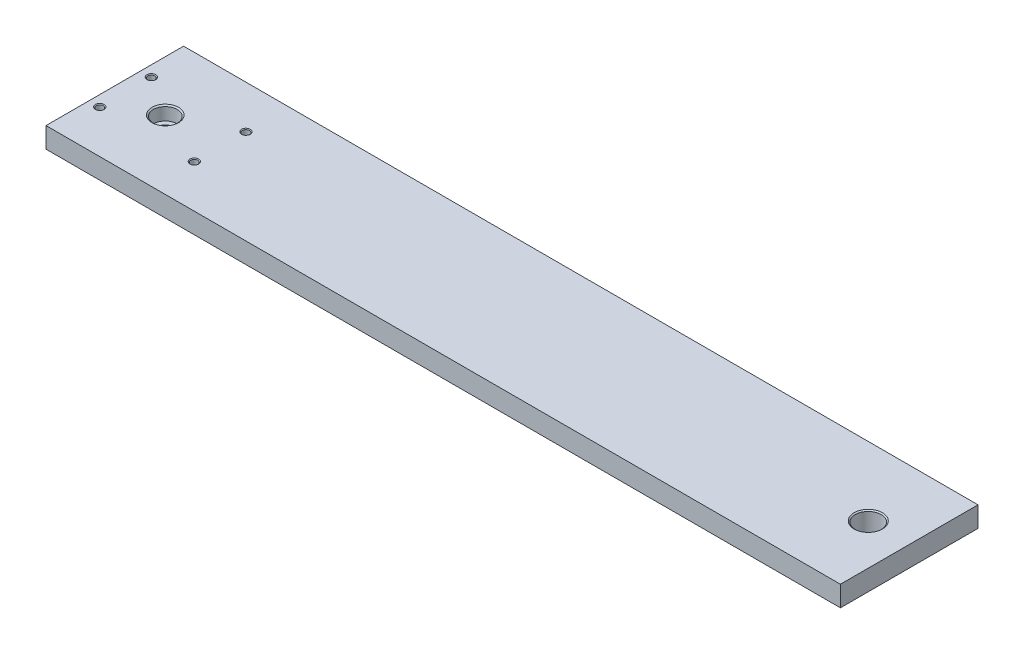
ISO-10303-21;
HEADER;
FILE_DESCRIPTION(('STEP AP214'),'2;1');
FILE_NAME('part.step','',(''),(''),'','','');
FILE_SCHEMA(('AUTOMOTIVE_DESIGN { 1 0 10303 214 1 1 1 1 }'));
ENDSEC;
DATA;
#1=APPLICATION_CONTEXT('core data for automotive mechanical design processes');
#2=APPLICATION_PROTOCOL_DEFINITION('international standard','automotive_design',2000,#1);
#3=PRODUCT_CONTEXT('',#1,'mechanical');
#4=PRODUCT('Part','Part','',(#3));
#5=PRODUCT_RELATED_PRODUCT_CATEGORY('part','',(#4));
#6=PRODUCT_DEFINITION_FORMATION('','',#4);
#7=PRODUCT_DEFINITION_CONTEXT('part definition',#1,'design');
#8=PRODUCT_DEFINITION('design','',#6,#7);
#9=PRODUCT_DEFINITION_SHAPE('','',#8);
#10=(LENGTH_UNIT() NAMED_UNIT(*) SI_UNIT(.MILLI.,.METRE.));
#11=(NAMED_UNIT(*) PLANE_ANGLE_UNIT() SI_UNIT($,.RADIAN.));
#12=(NAMED_UNIT(*) SI_UNIT($,.STERADIAN.) SOLID_ANGLE_UNIT());
#13=UNCERTAINTY_MEASURE_WITH_UNIT(LENGTH_MEASURE(1.E-05),#10,'distance_accuracy_value','');
#14=(GEOMETRIC_REPRESENTATION_CONTEXT(3) GLOBAL_UNCERTAINTY_ASSIGNED_CONTEXT((#13)) GLOBAL_UNIT_ASSIGNED_CONTEXT((#10,
#11,#12)) REPRESENTATION_CONTEXT('',''));
#15=CARTESIAN_POINT('',(0.,0.,0.));
#16=DIRECTION('',(0.,0.,1.));
#17=DIRECTION('',(1.,0.,0.));
#18=AXIS2_PLACEMENT_3D('',#15,#16,#17);
#19=CARTESIAN_POINT('',(0.,9.525,0.));
#20=DIRECTION('',(0.,-1.,0.));
#21=DIRECTION('',(0.,0.,-1.));
#22=AXIS2_PLACEMENT_3D('',#19,#20,#21);
#23=PLANE('',#22);
#24=CARTESIAN_POINT('',(49.,9.525,-44.));
#25=DIRECTION('',(0.,1.,0.));
#26=DIRECTION('',(0.,0.,1.));
#27=AXIS2_PLACEMENT_3D('',#24,#25,#26);
#28=CIRCLE('',#27,2.025);
#29=CARTESIAN_POINT('',(49.,9.525,-41.975));
#30=VERTEX_POINT('',#29);
#31=EDGE_CURVE('E159',#30,#30,#28,.T.);
#32=ORIENTED_EDGE('',*,*,#31,.F.);
#33=EDGE_LOOP('',(#32));
#34=FACE_BOUND('',#33,.T.);
#35=CARTESIAN_POINT('',(49.,9.525,-20.));
#36=DIRECTION('',(0.,1.,0.));
#37=DIRECTION('',(0.,0.,1.));
#38=AXIS2_PLACEMENT_3D('',#35,#36,#37);
#39=CIRCLE('',#38,2.025);
#40=CARTESIAN_POINT('',(49.,9.525,-17.975));
#41=VERTEX_POINT('',#40);
#42=EDGE_CURVE('E150',#41,#41,#39,.T.);
#43=ORIENTED_EDGE('',*,*,#42,.F.);
#44=EDGE_LOOP('',(#43));
#45=FACE_BOUND('',#44,.T.);
#46=CARTESIAN_POINT('',(5.,9.525,-44.));
#47=DIRECTION('',(0.,1.,0.));
#48=DIRECTION('',(0.,0.,1.));
#49=AXIS2_PLACEMENT_3D('',#46,#47,#48);
#50=CIRCLE('',#49,2.025);
#51=CARTESIAN_POINT('',(5.,9.525,-41.975));
#52=VERTEX_POINT('',#51);
#53=EDGE_CURVE('E141',#52,#52,#50,.T.);
#54=ORIENTED_EDGE('',*,*,#53,.F.);
#55=EDGE_LOOP('',(#54));
#56=FACE_BOUND('',#55,.T.);
#57=CARTESIAN_POINT('',(5.,9.525,-20.));
#58=DIRECTION('',(0.,1.,0.));
#59=DIRECTION('',(0.,0.,1.));
#60=AXIS2_PLACEMENT_3D('',#57,#58,#59);
#61=CIRCLE('',#60,2.025);
#62=CARTESIAN_POINT('',(5.,9.525,-17.975));
#63=VERTEX_POINT('',#62);
#64=EDGE_CURVE('E132',#63,#63,#61,.T.);
#65=ORIENTED_EDGE('',*,*,#64,.F.);
#66=EDGE_LOOP('',(#65));
#67=FACE_BOUND('',#66,.T.);
#68=CARTESIAN_POINT('',(350.52380619,9.525,-32.));
#69=DIRECTION('',(0.,1.,0.));
#70=DIRECTION('',(0.,0.,1.));
#71=AXIS2_PLACEMENT_3D('',#68,#69,#70);
#72=CIRCLE('',#71,6.588125);
#73=CARTESIAN_POINT('',(350.52380619,9.525,-25.411875));
#74=VERTEX_POINT('',#73);
#75=EDGE_CURVE('E123',#74,#74,#72,.T.);
#76=ORIENTED_EDGE('',*,*,#75,.F.);
#77=EDGE_LOOP('',(#76));
#78=FACE_BOUND('',#77,.T.);
#79=DIRECTION('',(0.,0.,1.));
#80=VECTOR('',#79,1.);
#81=CARTESIAN_POINT('',(0.,9.525,0.));
#82=LINE('',#81,#80);
#83=CARTESIAN_POINT('',(0.,9.525,-64.));
#84=VERTEX_POINT('',#83);
#85=CARTESIAN_POINT('',(0.,9.525,0.));
#86=VERTEX_POINT('',#85);
#87=EDGE_CURVE('E94',#84,#86,#82,.T.);
#88=ORIENTED_EDGE('',*,*,#87,.T.);
#89=DIRECTION('',(1.,0.,0.));
#90=VECTOR('',#89,1.);
#91=CARTESIAN_POINT('',(0.,9.525,0.));
#92=LINE('',#91,#90);
#93=CARTESIAN_POINT('',(369.57380619,9.525,0.));
#94=VERTEX_POINT('',#93);
#95=EDGE_CURVE('E89',#86,#94,#92,.T.);
#96=ORIENTED_EDGE('',*,*,#95,.T.);
#97=DIRECTION('',(0.,0.,-1.));
#98=VECTOR('',#97,1.);
#99=CARTESIAN_POINT('',(369.57380619,9.525,0.));
#100=LINE('',#99,#98);
#101=CARTESIAN_POINT('',(369.57380619,9.525,-64.));
#102=VERTEX_POINT('',#101);
#103=EDGE_CURVE('E92',#94,#102,#100,.T.);
#104=ORIENTED_EDGE('',*,*,#103,.T.);
#105=DIRECTION('',(-1.,0.,0.));
#106=VECTOR('',#105,1.);
#107=CARTESIAN_POINT('',(0.,9.525,-64.));
#108=LINE('',#107,#106);
#109=EDGE_CURVE('E59',#102,#84,#108,.T.);
#110=ORIENTED_EDGE('',*,*,#109,.T.);
#111=EDGE_LOOP('',(#88,#96,#104,#110));
#112=FACE_BOUND('',#111,.T.);
#113=CARTESIAN_POINT('',(23.5,9.525,-32.));
#114=DIRECTION('',(0.,1.,0.));
#115=DIRECTION('',(0.,0.,1.));
#116=AXIS2_PLACEMENT_3D('',#113,#114,#115);
#117=CIRCLE('',#116,6.19125);
#118=CARTESIAN_POINT('',(23.5,9.525,-25.80875));
#119=VERTEX_POINT('',#118);
#120=EDGE_CURVE('E174',#119,#119,#117,.T.);
#121=ORIENTED_EDGE('',*,*,#120,.F.);
#122=EDGE_LOOP('',(#121));
#123=FACE_BOUND('',#122,.T.);
#124=ADVANCED_FACE('F41',(#34,#45,#56,#67,#78,#112,#123),#23,.F.);
#125=CARTESIAN_POINT('',(0.,9.525,0.));
#126=DIRECTION('',(1.,0.,0.));
#127=DIRECTION('',(0.,0.,-1.));
#128=AXIS2_PLACEMENT_3D('',#125,#126,#127);
#129=PLANE('',#128);
#130=DIRECTION('',(0.,0.,1.));
#131=VECTOR('',#130,1.);
#132=CARTESIAN_POINT('',(0.,0.,0.));
#133=LINE('',#132,#131);
#134=CARTESIAN_POINT('',(0.,0.,-64.));
#135=VERTEX_POINT('',#134);
#136=CARTESIAN_POINT('',(0.,0.,0.));
#137=VERTEX_POINT('',#136);
#138=EDGE_CURVE('E107',#135,#137,#133,.T.);
#139=ORIENTED_EDGE('',*,*,#138,.T.);
#140=DIRECTION('',(0.,-1.,0.));
#141=VECTOR('',#140,1.);
#142=CARTESIAN_POINT('',(0.,9.525,0.));
#143=LINE('',#142,#141);
#144=EDGE_CURVE('E11',#86,#137,#143,.T.);
#145=ORIENTED_EDGE('',*,*,#144,.F.);
#146=ORIENTED_EDGE('',*,*,#87,.F.);
#147=DIRECTION('',(0.,-1.,0.));
#148=VECTOR('',#147,1.);
#149=CARTESIAN_POINT('',(0.,9.525,-64.));
#150=LINE('',#149,#148);
#151=EDGE_CURVE('E103',#84,#135,#150,.T.);
#152=ORIENTED_EDGE('',*,*,#151,.T.);
#153=EDGE_LOOP('',(#139,#145,#146,#152));
#154=FACE_BOUND('',#153,.T.);
#155=ADVANCED_FACE('F43',(#154),#129,.F.);
#156=CARTESIAN_POINT('',(0.,9.525,0.));
#157=DIRECTION('',(0.,0.,-1.));
#158=DIRECTION('',(-1.,0.,0.));
#159=AXIS2_PLACEMENT_3D('',#156,#157,#158);
#160=PLANE('',#159);
#161=DIRECTION('',(1.,0.,0.));
#162=VECTOR('',#161,1.);
#163=CARTESIAN_POINT('',(0.,0.,0.));
#164=LINE('',#163,#162);
#165=CARTESIAN_POINT('',(369.57380619,0.,0.));
#166=VERTEX_POINT('',#165);
#167=EDGE_CURVE('E98',#137,#166,#164,.T.);
#168=ORIENTED_EDGE('',*,*,#167,.T.);
#169=DIRECTION('',(0.,-1.,0.));
#170=VECTOR('',#169,1.);
#171=CARTESIAN_POINT('',(369.57380619,9.525,0.));
#172=LINE('',#171,#170);
#173=EDGE_CURVE('E51',#94,#166,#172,.T.);
#174=ORIENTED_EDGE('',*,*,#173,.F.);
#175=ORIENTED_EDGE('',*,*,#95,.F.);
#176=ORIENTED_EDGE('',*,*,#144,.T.);
#177=EDGE_LOOP('',(#168,#174,#175,#176));
#178=FACE_BOUND('',#177,.T.);
#179=ADVANCED_FACE('F97',(#178),#160,.F.);
#180=CARTESIAN_POINT('',(369.57380619,9.525,0.));
#181=DIRECTION('',(-1.,0.,0.));
#182=DIRECTION('',(0.,0.,1.));
#183=AXIS2_PLACEMENT_3D('',#180,#181,#182);
#184=PLANE('',#183);
#185=DIRECTION('',(0.,0.,-1.));
#186=VECTOR('',#185,1.);
#187=CARTESIAN_POINT('',(369.57380619,0.,0.));
#188=LINE('',#187,#186);
#189=CARTESIAN_POINT('',(369.57380619,0.,-64.));
#190=VERTEX_POINT('',#189);
#191=EDGE_CURVE('E76',#166,#190,#188,.T.);
#192=ORIENTED_EDGE('',*,*,#191,.T.);
#193=DIRECTION('',(0.,-1.,0.));
#194=VECTOR('',#193,1.);
#195=CARTESIAN_POINT('',(369.57380619,9.525,-64.));
#196=LINE('',#195,#194);
#197=EDGE_CURVE('E99',#102,#190,#196,.T.);
#198=ORIENTED_EDGE('',*,*,#197,.F.);
#199=ORIENTED_EDGE('',*,*,#103,.F.);
#200=ORIENTED_EDGE('',*,*,#173,.T.);
#201=EDGE_LOOP('',(#192,#198,#199,#200));
#202=FACE_BOUND('',#201,.T.);
#203=ADVANCED_FACE('F101',(#202),#184,.F.);
#204=CARTESIAN_POINT('',(0.,9.525,-64.));
#205=DIRECTION('',(0.,0.,1.));
#206=DIRECTION('',(1.,0.,0.));
#207=AXIS2_PLACEMENT_3D('',#204,#205,#206);
#208=PLANE('',#207);
#209=DIRECTION('',(-1.,0.,0.));
#210=VECTOR('',#209,1.);
#211=CARTESIAN_POINT('',(0.,0.,-64.));
#212=LINE('',#211,#210);
#213=EDGE_CURVE('E82',#190,#135,#212,.T.);
#214=ORIENTED_EDGE('',*,*,#213,.T.);
#215=ORIENTED_EDGE('',*,*,#151,.F.);
#216=ORIENTED_EDGE('',*,*,#109,.F.);
#217=ORIENTED_EDGE('',*,*,#197,.T.);
#218=EDGE_LOOP('',(#214,#215,#216,#217));
#219=FACE_BOUND('',#218,.T.);
#220=ADVANCED_FACE('F114',(#219),#208,.F.);
#221=CARTESIAN_POINT('',(0.,0.,0.));
#222=DIRECTION('',(0.,-1.,0.));
#223=DIRECTION('',(0.,0.,-1.));
#224=AXIS2_PLACEMENT_3D('',#221,#222,#223);
#225=PLANE('',#224);
#226=CARTESIAN_POINT('',(23.5,0.,-32.));
#227=DIRECTION('',(0.,1.,0.));
#228=DIRECTION('',(0.,0.,1.));
#229=AXIS2_PLACEMENT_3D('',#226,#227,#228);
#230=CIRCLE('',#229,3.3782);
#231=CARTESIAN_POINT('',(23.5,0.,-28.6218));
#232=VERTEX_POINT('',#231);
#233=EDGE_CURVE('E162',#232,#232,#230,.T.);
#234=ORIENTED_EDGE('',*,*,#233,.T.);
#235=EDGE_LOOP('',(#234));
#236=FACE_BOUND('',#235,.T.);
#237=CARTESIAN_POINT('',(49.,0.,-44.));
#238=DIRECTION('',(0.,1.,0.));
#239=DIRECTION('',(0.,0.,1.));
#240=AXIS2_PLACEMENT_3D('',#237,#238,#239);
#241=CIRCLE('',#240,1.65);
#242=CARTESIAN_POINT('',(49.,0.,-42.35));
#243=VERTEX_POINT('',#242);
#244=EDGE_CURVE('E153',#243,#243,#241,.T.);
#245=ORIENTED_EDGE('',*,*,#244,.T.);
#246=EDGE_LOOP('',(#245));
#247=FACE_BOUND('',#246,.T.);
#248=CARTESIAN_POINT('',(49.,0.,-20.));
#249=DIRECTION('',(0.,1.,0.));
#250=DIRECTION('',(0.,0.,1.));
#251=AXIS2_PLACEMENT_3D('',#248,#249,#250);
#252=CIRCLE('',#251,1.65);
#253=CARTESIAN_POINT('',(49.,0.,-18.35));
#254=VERTEX_POINT('',#253);
#255=EDGE_CURVE('E144',#254,#254,#252,.T.);
#256=ORIENTED_EDGE('',*,*,#255,.T.);
#257=EDGE_LOOP('',(#256));
#258=FACE_BOUND('',#257,.T.);
#259=CARTESIAN_POINT('',(5.,0.,-44.));
#260=DIRECTION('',(0.,1.,0.));
#261=DIRECTION('',(0.,0.,1.));
#262=AXIS2_PLACEMENT_3D('',#259,#260,#261);
#263=CIRCLE('',#262,1.65);
#264=CARTESIAN_POINT('',(5.,0.,-42.35));
#265=VERTEX_POINT('',#264);
#266=EDGE_CURVE('E135',#265,#265,#263,.T.);
#267=ORIENTED_EDGE('',*,*,#266,.T.);
#268=EDGE_LOOP('',(#267));
#269=FACE_BOUND('',#268,.T.);
#270=CARTESIAN_POINT('',(5.,0.,-20.));
#271=DIRECTION('',(0.,1.,0.));
#272=DIRECTION('',(0.,0.,1.));
#273=AXIS2_PLACEMENT_3D('',#270,#271,#272);
#274=CIRCLE('',#273,1.65);
#275=CARTESIAN_POINT('',(5.,0.,-18.35));
#276=VERTEX_POINT('',#275);
#277=EDGE_CURVE('E126',#276,#276,#274,.T.);
#278=ORIENTED_EDGE('',*,*,#277,.T.);
#279=EDGE_LOOP('',(#278));
#280=FACE_BOUND('',#279,.T.);
#281=CARTESIAN_POINT('',(350.52380619,0.,-32.));
#282=DIRECTION('',(0.,-1.,0.));
#283=DIRECTION('',(0.,0.,-1.));
#284=AXIS2_PLACEMENT_3D('',#281,#282,#283);
#285=CIRCLE('',#284,6.0325);
#286=CARTESIAN_POINT('',(350.52380619,0.,-38.0325));
#287=VERTEX_POINT('',#286);
#288=EDGE_CURVE('E45',#287,#287,#285,.T.);
#289=ORIENTED_EDGE('',*,*,#288,.F.);
#290=EDGE_LOOP('',(#289));
#291=FACE_BOUND('',#290,.T.);
#292=ORIENTED_EDGE('',*,*,#138,.F.);
#293=ORIENTED_EDGE('',*,*,#213,.F.);
#294=ORIENTED_EDGE('',*,*,#191,.F.);
#295=ORIENTED_EDGE('',*,*,#167,.F.);
#296=EDGE_LOOP('',(#292,#293,#294,#295));
#297=FACE_BOUND('',#296,.T.);
#298=ADVANCED_FACE('F117',(#236,#247,#258,#269,#280,#291,#297),#225,.T.);
#299=CARTESIAN_POINT('',(350.52380619,9.525,-32.));
#300=DIRECTION('',(0.,1.,0.));
#301=DIRECTION('',(0.,0.,1.));
#302=AXIS2_PLACEMENT_3D('',#299,#300,#301);
#303=CYLINDRICAL_SURFACE('',#302,6.0325);
#304=ORIENTED_EDGE('',*,*,#288,.T.);
#305=EDGE_LOOP('',(#304));
#306=FACE_BOUND('',#305,.T.);
#307=CARTESIAN_POINT('',(350.52380619,9.05877526742712,-32.));
#308=DIRECTION('',(0.,1.,0.));
#309=DIRECTION('',(0.,0.,1.));
#310=AXIS2_PLACEMENT_3D('',#307,#308,#309);
#311=CIRCLE('',#310,6.0325);
#312=CARTESIAN_POINT('',(350.52380619,9.05877526742712,-25.9675));
#313=VERTEX_POINT('',#312);
#314=EDGE_CURVE('E120',#313,#313,#311,.T.);
#315=ORIENTED_EDGE('',*,*,#314,.T.);
#316=EDGE_LOOP('',(#315));
#317=FACE_BOUND('',#316,.T.);
#318=ADVANCED_FACE('F189',(#306,#317),#303,.F.);
#319=CARTESIAN_POINT('',(350.52380619,9.525,-32.));
#320=DIRECTION('',(0.,1.,0.));
#321=DIRECTION('',(0.,0.,1.));
#322=AXIS2_PLACEMENT_3D('',#319,#320,#321);
#323=CONICAL_SURFACE('',#322,6.588125,0.872664625997171);
#324=ORIENTED_EDGE('',*,*,#314,.F.);
#325=EDGE_LOOP('',(#324));
#326=FACE_BOUND('',#325,.T.);
#327=ORIENTED_EDGE('',*,*,#75,.T.);
#328=EDGE_LOOP('',(#327));
#329=FACE_BOUND('',#328,.T.);
#330=ADVANCED_FACE('F221',(#326,#329),#323,.F.);
#331=CARTESIAN_POINT('',(5.,9.525,-20.));
#332=DIRECTION('',(0.,1.,0.));
#333=DIRECTION('',(0.,0.,1.));
#334=AXIS2_PLACEMENT_3D('',#331,#332,#333);
#335=CYLINDRICAL_SURFACE('',#334,1.65);
#336=ORIENTED_EDGE('',*,*,#277,.F.);
#337=EDGE_LOOP('',(#336));
#338=FACE_BOUND('',#337,.T.);
#339=CARTESIAN_POINT('',(5.,9.21033763830852,-20.));
#340=DIRECTION('',(0.,1.,0.));
#341=DIRECTION('',(0.,0.,1.));
#342=AXIS2_PLACEMENT_3D('',#339,#340,#341);
#343=CIRCLE('',#342,1.65);
#344=CARTESIAN_POINT('',(5.,9.21033763830852,-18.35));
#345=VERTEX_POINT('',#344);
#346=EDGE_CURVE('E129',#345,#345,#343,.T.);
#347=ORIENTED_EDGE('',*,*,#346,.T.);
#348=EDGE_LOOP('',(#347));
#349=FACE_BOUND('',#348,.T.);
#350=ADVANCED_FACE('F228',(#338,#349),#335,.F.);
#351=CARTESIAN_POINT('',(5.,9.525,-20.));
#352=DIRECTION('',(0.,1.,0.));
#353=DIRECTION('',(0.,0.,1.));
#354=AXIS2_PLACEMENT_3D('',#351,#352,#353);
#355=CONICAL_SURFACE('',#354,2.025,0.872664625997165);
#356=ORIENTED_EDGE('',*,*,#346,.F.);
#357=EDGE_LOOP('',(#356));
#358=FACE_BOUND('',#357,.T.);
#359=ORIENTED_EDGE('',*,*,#64,.T.);
#360=EDGE_LOOP('',(#359));
#361=FACE_BOUND('',#360,.T.);
#362=ADVANCED_FACE('F236',(#358,#361),#355,.F.);
#363=CARTESIAN_POINT('',(5.,9.525,-44.));
#364=DIRECTION('',(0.,1.,0.));
#365=DIRECTION('',(0.,0.,1.));
#366=AXIS2_PLACEMENT_3D('',#363,#364,#365);
#367=CYLINDRICAL_SURFACE('',#366,1.65);
#368=ORIENTED_EDGE('',*,*,#266,.F.);
#369=EDGE_LOOP('',(#368));
#370=FACE_BOUND('',#369,.T.);
#371=CARTESIAN_POINT('',(5.,9.21033763830852,-44.));
#372=DIRECTION('',(0.,1.,0.));
#373=DIRECTION('',(0.,0.,1.));
#374=AXIS2_PLACEMENT_3D('',#371,#372,#373);
#375=CIRCLE('',#374,1.65);
#376=CARTESIAN_POINT('',(5.,9.21033763830852,-42.35));
#377=VERTEX_POINT('',#376);
#378=EDGE_CURVE('E138',#377,#377,#375,.T.);
#379=ORIENTED_EDGE('',*,*,#378,.T.);
#380=EDGE_LOOP('',(#379));
#381=FACE_BOUND('',#380,.T.);
#382=ADVANCED_FACE('F245',(#370,#381),#367,.F.);
#383=CARTESIAN_POINT('',(5.,9.525,-44.));
#384=DIRECTION('',(0.,1.,0.));
#385=DIRECTION('',(0.,0.,1.));
#386=AXIS2_PLACEMENT_3D('',#383,#384,#385);
#387=CONICAL_SURFACE('',#386,2.025,0.872664625997165);
#388=ORIENTED_EDGE('',*,*,#378,.F.);
#389=EDGE_LOOP('',(#388));
#390=FACE_BOUND('',#389,.T.);
#391=ORIENTED_EDGE('',*,*,#53,.T.);
#392=EDGE_LOOP('',(#391));
#393=FACE_BOUND('',#392,.T.);
#394=ADVANCED_FACE('F253',(#390,#393),#387,.F.);
#395=CARTESIAN_POINT('',(49.,9.525,-20.));
#396=DIRECTION('',(0.,1.,0.));
#397=DIRECTION('',(0.,0.,1.));
#398=AXIS2_PLACEMENT_3D('',#395,#396,#397);
#399=CYLINDRICAL_SURFACE('',#398,1.65);
#400=ORIENTED_EDGE('',*,*,#255,.F.);
#401=EDGE_LOOP('',(#400));
#402=FACE_BOUND('',#401,.T.);
#403=CARTESIAN_POINT('',(49.,9.21033763830852,-20.));
#404=DIRECTION('',(0.,1.,0.));
#405=DIRECTION('',(0.,0.,1.));
#406=AXIS2_PLACEMENT_3D('',#403,#404,#405);
#407=CIRCLE('',#406,1.65);
#408=CARTESIAN_POINT('',(49.,9.21033763830852,-18.35));
#409=VERTEX_POINT('',#408);
#410=EDGE_CURVE('E147',#409,#409,#407,.T.);
#411=ORIENTED_EDGE('',*,*,#410,.T.);
#412=EDGE_LOOP('',(#411));
#413=FACE_BOUND('',#412,.T.);
#414=ADVANCED_FACE('F260',(#402,#413),#399,.F.);
#415=CARTESIAN_POINT('',(49.,9.525,-20.));
#416=DIRECTION('',(0.,1.,0.));
#417=DIRECTION('',(0.,0.,1.));
#418=AXIS2_PLACEMENT_3D('',#415,#416,#417);
#419=CONICAL_SURFACE('',#418,2.025,0.872664625997164);
#420=ORIENTED_EDGE('',*,*,#410,.F.);
#421=EDGE_LOOP('',(#420));
#422=FACE_BOUND('',#421,.T.);
#423=ORIENTED_EDGE('',*,*,#42,.T.);
#424=EDGE_LOOP('',(#423));
#425=FACE_BOUND('',#424,.T.);
#426=ADVANCED_FACE('F269',(#422,#425),#419,.F.);
#427=CARTESIAN_POINT('',(49.,9.525,-44.));
#428=DIRECTION('',(0.,1.,0.));
#429=DIRECTION('',(0.,0.,1.));
#430=AXIS2_PLACEMENT_3D('',#427,#428,#429);
#431=CYLINDRICAL_SURFACE('',#430,1.65);
#432=ORIENTED_EDGE('',*,*,#244,.F.);
#433=EDGE_LOOP('',(#432));
#434=FACE_BOUND('',#433,.T.);
#435=CARTESIAN_POINT('',(49.,9.21033763830852,-44.));
#436=DIRECTION('',(0.,1.,0.));
#437=DIRECTION('',(0.,0.,1.));
#438=AXIS2_PLACEMENT_3D('',#435,#436,#437);
#439=CIRCLE('',#438,1.65);
#440=CARTESIAN_POINT('',(49.,9.21033763830852,-42.35));
#441=VERTEX_POINT('',#440);
#442=EDGE_CURVE('E156',#441,#441,#439,.T.);
#443=ORIENTED_EDGE('',*,*,#442,.T.);
#444=EDGE_LOOP('',(#443));
#445=FACE_BOUND('',#444,.T.);
#446=ADVANCED_FACE('F276',(#434,#445),#431,.F.);
#447=CARTESIAN_POINT('',(49.,9.525,-44.));
#448=DIRECTION('',(0.,1.,0.));
#449=DIRECTION('',(0.,0.,1.));
#450=AXIS2_PLACEMENT_3D('',#447,#448,#449);
#451=CONICAL_SURFACE('',#450,2.025,0.872664625997164);
#452=ORIENTED_EDGE('',*,*,#442,.F.);
#453=EDGE_LOOP('',(#452));
#454=FACE_BOUND('',#453,.T.);
#455=ORIENTED_EDGE('',*,*,#31,.T.);
#456=EDGE_LOOP('',(#455));
#457=FACE_BOUND('',#456,.T.);
#458=ADVANCED_FACE('F284',(#454,#457),#451,.F.);
#459=CARTESIAN_POINT('',(23.5,9.525,-32.));
#460=DIRECTION('',(0.,1.,0.));
#461=DIRECTION('',(0.,0.,1.));
#462=AXIS2_PLACEMENT_3D('',#459,#460,#461);
#463=CYLINDRICAL_SURFACE('',#462,3.3782);
#464=ORIENTED_EDGE('',*,*,#233,.F.);
#465=EDGE_LOOP('',(#464));
#466=FACE_BOUND('',#465,.T.);
#467=CARTESIAN_POINT('',(23.5,3.175,-32.));
#468=DIRECTION('',(0.,1.,0.));
#469=DIRECTION('',(0.,0.,1.));
#470=AXIS2_PLACEMENT_3D('',#467,#468,#469);
#471=CIRCLE('',#470,3.3782);
#472=CARTESIAN_POINT('',(23.5,3.175,-28.6218));
#473=VERTEX_POINT('',#472);
#474=EDGE_CURVE('E165',#473,#473,#471,.T.);
#475=ORIENTED_EDGE('',*,*,#474,.T.);
#476=EDGE_LOOP('',(#475));
#477=FACE_BOUND('',#476,.T.);
#478=ADVANCED_FACE('F291',(#466,#477),#463,.F.);
#479=CARTESIAN_POINT('',(29.05625,3.175,-32.));
#480=DIRECTION('',(0.,-1.,0.));
#481=DIRECTION('',(0.,0.,-1.));
#482=AXIS2_PLACEMENT_3D('',#479,#480,#481);
#483=PLANE('',#482);
#484=ORIENTED_EDGE('',*,*,#474,.F.);
#485=EDGE_LOOP('',(#484));
#486=FACE_BOUND('',#485,.T.);
#487=CARTESIAN_POINT('',(23.5,3.175,-32.));
#488=DIRECTION('',(0.,1.,0.));
#489=DIRECTION('',(0.,0.,1.));
#490=AXIS2_PLACEMENT_3D('',#487,#488,#489);
#491=CIRCLE('',#490,5.55625);
#492=CARTESIAN_POINT('',(23.5,3.175,-26.44375));
#493=VERTEX_POINT('',#492);
#494=EDGE_CURVE('E168',#493,#493,#491,.T.);
#495=ORIENTED_EDGE('',*,*,#494,.T.);
#496=EDGE_LOOP('',(#495));
#497=FACE_BOUND('',#496,.T.);
#498=ADVANCED_FACE('F298',(#486,#497),#483,.F.);
#499=CARTESIAN_POINT('',(23.5,9.525,-32.));
#500=DIRECTION('',(0.,1.,0.));
#501=DIRECTION('',(0.,0.,1.));
#502=AXIS2_PLACEMENT_3D('',#499,#500,#501);
#503=CYLINDRICAL_SURFACE('',#502,5.55625);
#504=ORIENTED_EDGE('',*,*,#494,.F.);
#505=EDGE_LOOP('',(#504));
#506=FACE_BOUND('',#505,.T.);
#507=CARTESIAN_POINT('',(23.5,8.99217173420243,-32.));
#508=DIRECTION('',(0.,1.,0.));
#509=DIRECTION('',(0.,0.,1.));
#510=AXIS2_PLACEMENT_3D('',#507,#508,#509);
#511=CIRCLE('',#510,5.55625);
#512=CARTESIAN_POINT('',(23.5,8.99217173420243,-26.44375));
#513=VERTEX_POINT('',#512);
#514=EDGE_CURVE('E171',#513,#513,#511,.T.);
#515=ORIENTED_EDGE('',*,*,#514,.T.);
#516=EDGE_LOOP('',(#515));
#517=FACE_BOUND('',#516,.T.);
#518=ADVANCED_FACE('F306',(#506,#517),#503,.F.);
#519=CARTESIAN_POINT('',(23.5,9.525,-32.));
#520=DIRECTION('',(0.,1.,0.));
#521=DIRECTION('',(0.,0.,1.));
#522=AXIS2_PLACEMENT_3D('',#519,#520,#521);
#523=CONICAL_SURFACE('',#522,6.19125,0.872664625997164);
#524=ORIENTED_EDGE('',*,*,#514,.F.);
#525=EDGE_LOOP('',(#524));
#526=FACE_BOUND('',#525,.T.);
#527=ORIENTED_EDGE('',*,*,#120,.T.);
#528=EDGE_LOOP('',(#527));
#529=FACE_BOUND('',#528,.T.);
#530=ADVANCED_FACE('F178',(#526,#529),#523,.F.);
#531=CLOSED_SHELL('',(#124,#155,#179,#203,#220,#298,#318,#330,#350,#362,#382,#394,#414,#426,
#446,#458,#478,#498,#518,#530));
#532=MANIFOLD_SOLID_BREP('B2',#531);
#533=ADVANCED_BREP_SHAPE_REPRESENTATION('',(#18,#532),#14);
#534=SHAPE_DEFINITION_REPRESENTATION(#9,#533);
ENDSEC;
END-ISO-10303-21;
